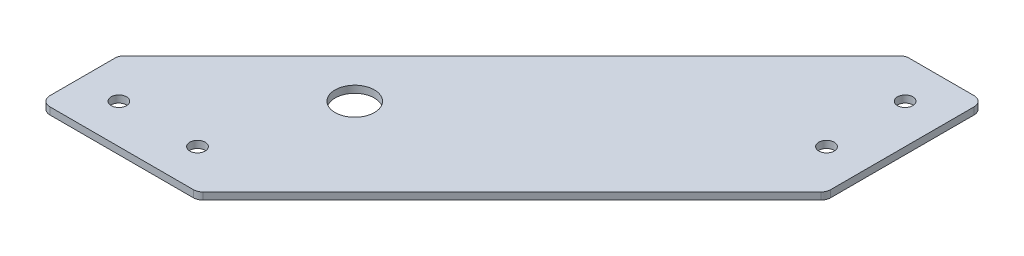
ISO-10303-21;
HEADER;
FILE_DESCRIPTION(('STEP AP214'),'2;1');
FILE_NAME('part.step','',(''),(''),'','','');
FILE_SCHEMA(('AUTOMOTIVE_DESIGN { 1 0 10303 214 1 1 1 1 }'));
ENDSEC;
DATA;
#1=APPLICATION_CONTEXT('core data for automotive mechanical design processes');
#2=APPLICATION_PROTOCOL_DEFINITION('international standard','automotive_design',2000,#1);
#3=PRODUCT_CONTEXT('',#1,'mechanical');
#4=PRODUCT('Part','Part','',(#3));
#5=PRODUCT_RELATED_PRODUCT_CATEGORY('part','',(#4));
#6=PRODUCT_DEFINITION_FORMATION('','',#4);
#7=PRODUCT_DEFINITION_CONTEXT('part definition',#1,'design');
#8=PRODUCT_DEFINITION('design','',#6,#7);
#9=PRODUCT_DEFINITION_SHAPE('','',#8);
#10=(LENGTH_UNIT() NAMED_UNIT(*) SI_UNIT(.MILLI.,.METRE.));
#11=(NAMED_UNIT(*) PLANE_ANGLE_UNIT() SI_UNIT($,.RADIAN.));
#12=(NAMED_UNIT(*) SI_UNIT($,.STERADIAN.) SOLID_ANGLE_UNIT());
#13=UNCERTAINTY_MEASURE_WITH_UNIT(LENGTH_MEASURE(1.E-05),#10,'distance_accuracy_value','');
#14=(GEOMETRIC_REPRESENTATION_CONTEXT(3) GLOBAL_UNCERTAINTY_ASSIGNED_CONTEXT((#13)) GLOBAL_UNIT_ASSIGNED_CONTEXT((#10,
#11,#12)) REPRESENTATION_CONTEXT('',''));
#15=CARTESIAN_POINT('',(0.,0.,0.));
#16=DIRECTION('',(0.,0.,1.));
#17=DIRECTION('',(1.,0.,0.));
#18=AXIS2_PLACEMENT_3D('',#15,#16,#17);
#19=CARTESIAN_POINT('',(0.,1.143,0.));
#20=DIRECTION('',(0.,1.,0.));
#21=DIRECTION('',(0.,0.,1.));
#22=AXIS2_PLACEMENT_3D('',#19,#20,#21);
#23=PLANE('',#22);
#24=DIRECTION('',(0.,0.,1.));
#25=VECTOR('',#24,1.);
#26=CARTESIAN_POINT('',(-152.4,1.143,-25.4));
#27=LINE('',#26,#25);
#28=CARTESIAN_POINT('',(-152.4,1.143,-24.0848719394655));
#29=VERTEX_POINT('',#28);
#30=CARTESIAN_POINT('',(-152.4,1.143,-3.175));
#31=VERTEX_POINT('',#30);
#32=EDGE_CURVE('E164',#29,#31,#27,.T.);
#33=ORIENTED_EDGE('',*,*,#32,.T.);
#34=CARTESIAN_POINT('',(-149.225,1.143,-3.175));
#35=DIRECTION('',(0.,1.,0.));
#36=DIRECTION('',(0.,0.,1.));
#37=AXIS2_PLACEMENT_3D('',#34,#35,#36);
#38=CIRCLE('',#37,3.175);
#39=CARTESIAN_POINT('',(-149.225,1.143,0.));
#40=VERTEX_POINT('',#39);
#41=EDGE_CURVE('E193',#31,#40,#38,.T.);
#42=ORIENTED_EDGE('',*,*,#41,.T.);
#43=DIRECTION('',(1.,0.,0.));
#44=VECTOR('',#43,1.);
#45=CARTESIAN_POINT('',(-152.4,1.143,0.));
#46=LINE('',#45,#44);
#47=CARTESIAN_POINT('',(-102.915128060536,1.143,0.));
#48=VERTEX_POINT('',#47);
#49=EDGE_CURVE('E145',#40,#48,#46,.T.);
#50=ORIENTED_EDGE('',*,*,#49,.T.);
#51=CARTESIAN_POINT('',(-102.915128060536,1.143,-3.175));
#52=DIRECTION('',(0.,1.,0.));
#53=DIRECTION('',(0.,0.,1.));
#54=AXIS2_PLACEMENT_3D('',#51,#52,#53);
#55=CIRCLE('',#54,3.175);
#56=CARTESIAN_POINT('',(-100.670064030268,1.143,-0.929935969732676));
#57=VERTEX_POINT('',#56);
#58=EDGE_CURVE('E186',#48,#57,#55,.T.);
#59=ORIENTED_EDGE('',*,*,#58,.T.);
#60=DIRECTION('',(-0.707106781186551,0.,0.707106781186544));
#61=VECTOR('',#60,1.);
#62=CARTESIAN_POINT('',(0.,1.143,-101.6));
#63=LINE('',#62,#61);
#64=CARTESIAN_POINT('',(-0.929935969732728,1.143,-100.670064030267));
#65=VERTEX_POINT('',#64);
#66=EDGE_CURVE('E215',#65,#57,#63,.T.);
#67=ORIENTED_EDGE('',*,*,#66,.F.);
#68=CARTESIAN_POINT('',(-3.175,1.143,-102.915128060535));
#69=DIRECTION('',(0.,1.,0.));
#70=DIRECTION('',(0.,0.,1.));
#71=AXIS2_PLACEMENT_3D('',#68,#69,#70);
#72=CIRCLE('',#71,3.175);
#73=CARTESIAN_POINT('',(0.,1.143,-102.915128060535));
#74=VERTEX_POINT('',#73);
#75=EDGE_CURVE('E188',#65,#74,#72,.T.);
#76=ORIENTED_EDGE('',*,*,#75,.T.);
#77=DIRECTION('',(0.,0.,-1.));
#78=VECTOR('',#77,1.);
#79=CARTESIAN_POINT('',(0.,1.143,0.));
#80=LINE('',#79,#78);
#81=CARTESIAN_POINT('',(0.,1.143,-149.225));
#82=VERTEX_POINT('',#81);
#83=EDGE_CURVE('E224',#74,#82,#80,.T.);
#84=ORIENTED_EDGE('',*,*,#83,.T.);
#85=CARTESIAN_POINT('',(-3.175,1.143,-149.225));
#86=DIRECTION('',(0.,1.,0.));
#87=DIRECTION('',(0.,0.,1.));
#88=AXIS2_PLACEMENT_3D('',#85,#86,#87);
#89=CIRCLE('',#88,3.175);
#90=CARTESIAN_POINT('',(-3.175,1.143,-152.4));
#91=VERTEX_POINT('',#90);
#92=EDGE_CURVE('E190',#82,#91,#89,.T.);
#93=ORIENTED_EDGE('',*,*,#92,.T.);
#94=DIRECTION('',(-1.,0.,0.));
#95=VECTOR('',#94,1.);
#96=CARTESIAN_POINT('',(0.,1.143,-152.4));
#97=LINE('',#96,#95);
#98=CARTESIAN_POINT('',(-24.0848719394654,1.143,-152.4));
#99=VERTEX_POINT('',#98);
#100=EDGE_CURVE('E227',#91,#99,#97,.T.);
#101=ORIENTED_EDGE('',*,*,#100,.T.);
#102=CARTESIAN_POINT('',(-24.0848719394654,1.143,-149.225));
#103=DIRECTION('',(0.,1.,0.));
#104=DIRECTION('',(0.,0.,1.));
#105=AXIS2_PLACEMENT_3D('',#102,#103,#104);
#106=CIRCLE('',#105,3.175);
#107=CARTESIAN_POINT('',(-26.3299359697327,1.143,-151.470064030267));
#108=VERTEX_POINT('',#107);
#109=EDGE_CURVE('E55',#99,#108,#106,.T.);
#110=ORIENTED_EDGE('',*,*,#109,.T.);
#111=DIRECTION('',(-0.707106781186548,0.,0.707106781186548));
#112=VECTOR('',#111,1.);
#113=CARTESIAN_POINT('',(-25.4,1.143,-152.4));
#114=LINE('',#113,#112);
#115=CARTESIAN_POINT('',(-151.470064030267,1.143,-26.3299359697327));
#116=VERTEX_POINT('',#115);
#117=EDGE_CURVE('E231',#108,#116,#114,.T.);
#118=ORIENTED_EDGE('',*,*,#117,.T.);
#119=CARTESIAN_POINT('',(-149.225,1.143,-24.0848719394655));
#120=DIRECTION('',(0.,1.,0.));
#121=DIRECTION('',(0.,0.,1.));
#122=AXIS2_PLACEMENT_3D('',#119,#120,#121);
#123=CIRCLE('',#122,3.175);
#124=EDGE_CURVE('E184',#116,#29,#123,.T.);
#125=ORIENTED_EDGE('',*,*,#124,.T.);
#126=EDGE_LOOP('',(#33,#42,#50,#59,#67,#76,#84,#93,#101,#110,#118,#125));
#127=FACE_BOUND('',#126,.T.);
#128=CARTESIAN_POINT('',(-139.7,1.143,-12.6999999999939));
#129=DIRECTION('',(0.,1.,0.));
#130=DIRECTION('',(0.,0.,1.));
#131=AXIS2_PLACEMENT_3D('',#128,#129,#130);
#132=CIRCLE('',#131,2.4892);
#133=CARTESIAN_POINT('',(-139.7,1.143,-10.2107999999939));
#134=VERTEX_POINT('',#133);
#135=EDGE_CURVE('E267',#134,#134,#132,.T.);
#136=ORIENTED_EDGE('',*,*,#135,.F.);
#137=EDGE_LOOP('',(#136));
#138=FACE_BOUND('',#137,.T.);
#139=CARTESIAN_POINT('',(-114.3,1.143,-12.6999999999951));
#140=DIRECTION('',(0.,1.,0.));
#141=DIRECTION('',(0.,0.,1.));
#142=AXIS2_PLACEMENT_3D('',#139,#140,#141);
#143=CIRCLE('',#142,2.4892);
#144=CARTESIAN_POINT('',(-114.3,1.143,-10.2107999999951));
#145=VERTEX_POINT('',#144);
#146=EDGE_CURVE('E155',#145,#145,#143,.T.);
#147=ORIENTED_EDGE('',*,*,#146,.F.);
#148=EDGE_LOOP('',(#147));
#149=FACE_BOUND('',#148,.T.);
#150=CARTESIAN_POINT('',(-101.6,1.143,-50.8));
#151=DIRECTION('',(0.,1.,0.));
#152=DIRECTION('',(0.,0.,1.));
#153=AXIS2_PLACEMENT_3D('',#150,#151,#152);
#154=CIRCLE('',#153,6.35000000000001);
#155=CARTESIAN_POINT('',(-101.6,1.143,-44.45));
#156=VERTEX_POINT('',#155);
#157=EDGE_CURVE('E279',#156,#156,#154,.T.);
#158=ORIENTED_EDGE('',*,*,#157,.F.);
#159=EDGE_LOOP('',(#158));
#160=FACE_BOUND('',#159,.T.);
#161=CARTESIAN_POINT('',(-12.7000000000003,1.143,-114.3));
#162=DIRECTION('',(0.,1.,0.));
#163=DIRECTION('',(0.,0.,1.));
#164=AXIS2_PLACEMENT_3D('',#161,#162,#163);
#165=CIRCLE('',#164,2.48919999999999);
#166=CARTESIAN_POINT('',(-12.7000000000003,1.143,-111.8108));
#167=VERTEX_POINT('',#166);
#168=EDGE_CURVE('E273',#167,#167,#165,.T.);
#169=ORIENTED_EDGE('',*,*,#168,.F.);
#170=EDGE_LOOP('',(#169));
#171=FACE_BOUND('',#170,.T.);
#172=CARTESIAN_POINT('',(-12.7000000000004,1.143,-139.7));
#173=DIRECTION('',(0.,1.,0.));
#174=DIRECTION('',(0.,0.,1.));
#175=AXIS2_PLACEMENT_3D('',#172,#173,#174);
#176=CIRCLE('',#175,2.4892);
#177=CARTESIAN_POINT('',(-12.7000000000004,1.143,-137.2108));
#178=VERTEX_POINT('',#177);
#179=EDGE_CURVE('E261',#178,#178,#176,.T.);
#180=ORIENTED_EDGE('',*,*,#179,.F.);
#181=EDGE_LOOP('',(#180));
#182=FACE_BOUND('',#181,.T.);
#183=ADVANCED_FACE('F33',(#127,#138,#149,#160,#171,#182),#23,.T.);
#184=CARTESIAN_POINT('',(0.,-1.143,0.));
#185=DIRECTION('',(0.,1.,0.));
#186=DIRECTION('',(0.,0.,1.));
#187=AXIS2_PLACEMENT_3D('',#184,#185,#186);
#188=PLANE('',#187);
#189=DIRECTION('',(1.,0.,0.));
#190=VECTOR('',#189,1.);
#191=CARTESIAN_POINT('',(-152.4,-1.143,0.));
#192=LINE('',#191,#190);
#193=CARTESIAN_POINT('',(-149.225,-1.143,0.));
#194=VERTEX_POINT('',#193);
#195=CARTESIAN_POINT('',(-102.915128060536,-1.143,0.));
#196=VERTEX_POINT('',#195);
#197=EDGE_CURVE('E142',#194,#196,#192,.T.);
#198=ORIENTED_EDGE('',*,*,#197,.F.);
#199=CARTESIAN_POINT('',(-149.225,-1.143,-3.175));
#200=DIRECTION('',(0.,1.,0.));
#201=DIRECTION('',(0.,0.,1.));
#202=AXIS2_PLACEMENT_3D('',#199,#200,#201);
#203=CIRCLE('',#202,3.175);
#204=CARTESIAN_POINT('',(-152.4,-1.143,-3.175));
#205=VERTEX_POINT('',#204);
#206=EDGE_CURVE('E124',#194,#205,#203,.F.);
#207=ORIENTED_EDGE('',*,*,#206,.T.);
#208=DIRECTION('',(0.,0.,1.));
#209=VECTOR('',#208,1.);
#210=CARTESIAN_POINT('',(-152.4,-1.143,-25.4));
#211=LINE('',#210,#209);
#212=CARTESIAN_POINT('',(-152.4,-1.143,-24.0848719394655));
#213=VERTEX_POINT('',#212);
#214=EDGE_CURVE('E171',#213,#205,#211,.T.);
#215=ORIENTED_EDGE('',*,*,#214,.F.);
#216=CARTESIAN_POINT('',(-149.225,-1.143,-24.0848719394655));
#217=DIRECTION('',(0.,1.,0.));
#218=DIRECTION('',(0.,0.,1.));
#219=AXIS2_PLACEMENT_3D('',#216,#217,#218);
#220=CIRCLE('',#219,3.175);
#221=CARTESIAN_POINT('',(-151.470064030267,-1.143,-26.3299359697327));
#222=VERTEX_POINT('',#221);
#223=EDGE_CURVE('E146',#213,#222,#220,.F.);
#224=ORIENTED_EDGE('',*,*,#223,.T.);
#225=DIRECTION('',(-0.707106781186548,0.,0.707106781186548));
#226=VECTOR('',#225,1.);
#227=CARTESIAN_POINT('',(-25.4,-1.143,-152.4));
#228=LINE('',#227,#226);
#229=CARTESIAN_POINT('',(-26.3299359697327,-1.143,-151.470064030267));
#230=VERTEX_POINT('',#229);
#231=EDGE_CURVE('E169',#230,#222,#228,.T.);
#232=ORIENTED_EDGE('',*,*,#231,.F.);
#233=CARTESIAN_POINT('',(-24.0848719394654,-1.143,-149.225));
#234=DIRECTION('',(0.,1.,0.));
#235=DIRECTION('',(0.,0.,1.));
#236=AXIS2_PLACEMENT_3D('',#233,#234,#235);
#237=CIRCLE('',#236,3.175);
#238=CARTESIAN_POINT('',(-24.0848719394654,-1.143,-152.4));
#239=VERTEX_POINT('',#238);
#240=EDGE_CURVE('E135',#230,#239,#237,.F.);
#241=ORIENTED_EDGE('',*,*,#240,.T.);
#242=DIRECTION('',(-1.,0.,0.));
#243=VECTOR('',#242,1.);
#244=CARTESIAN_POINT('',(0.,-1.143,-152.4));
#245=LINE('',#244,#243);
#246=CARTESIAN_POINT('',(-3.175,-1.143,-152.4));
#247=VERTEX_POINT('',#246);
#248=EDGE_CURVE('E158',#247,#239,#245,.T.);
#249=ORIENTED_EDGE('',*,*,#248,.F.);
#250=CARTESIAN_POINT('',(-3.175,-1.143,-149.225));
#251=DIRECTION('',(0.,1.,0.));
#252=DIRECTION('',(0.,0.,1.));
#253=AXIS2_PLACEMENT_3D('',#250,#251,#252);
#254=CIRCLE('',#253,3.175);
#255=CARTESIAN_POINT('',(0.,-1.143,-149.225));
#256=VERTEX_POINT('',#255);
#257=EDGE_CURVE('E178',#247,#256,#254,.F.);
#258=ORIENTED_EDGE('',*,*,#257,.T.);
#259=DIRECTION('',(0.,0.,-1.));
#260=VECTOR('',#259,1.);
#261=CARTESIAN_POINT('',(0.,-1.143,0.));
#262=LINE('',#261,#260);
#263=CARTESIAN_POINT('',(0.,-1.143,-102.915128060535));
#264=VERTEX_POINT('',#263);
#265=EDGE_CURVE('E154',#264,#256,#262,.T.);
#266=ORIENTED_EDGE('',*,*,#265,.F.);
#267=CARTESIAN_POINT('',(-3.175,-1.143,-102.915128060535));
#268=DIRECTION('',(0.,1.,0.));
#269=DIRECTION('',(0.,0.,1.));
#270=AXIS2_PLACEMENT_3D('',#267,#268,#269);
#271=CIRCLE('',#270,3.175);
#272=CARTESIAN_POINT('',(-0.929935969732728,-1.143,-100.670064030267));
#273=VERTEX_POINT('',#272);
#274=EDGE_CURVE('E176',#264,#273,#271,.F.);
#275=ORIENTED_EDGE('',*,*,#274,.T.);
#276=DIRECTION('',(-0.707106781186551,0.,0.707106781186544));
#277=VECTOR('',#276,1.);
#278=CARTESIAN_POINT('',(0.,-1.143,-101.6));
#279=LINE('',#278,#277);
#280=CARTESIAN_POINT('',(-100.670064030268,-1.143,-0.929935969732676));
#281=VERTEX_POINT('',#280);
#282=EDGE_CURVE('E212',#273,#281,#279,.T.);
#283=ORIENTED_EDGE('',*,*,#282,.T.);
#284=CARTESIAN_POINT('',(-102.915128060536,-1.143,-3.175));
#285=DIRECTION('',(0.,1.,0.));
#286=DIRECTION('',(0.,0.,1.));
#287=AXIS2_PLACEMENT_3D('',#284,#285,#286);
#288=CIRCLE('',#287,3.175);
#289=EDGE_CURVE('E153',#281,#196,#288,.F.);
#290=ORIENTED_EDGE('',*,*,#289,.T.);
#291=EDGE_LOOP('',(#198,#207,#215,#224,#232,#241,#249,#258,#266,#275,#283,#290));
#292=FACE_BOUND('',#291,.T.);
#293=CARTESIAN_POINT('',(-139.7,-1.143,-12.6999999999939));
#294=DIRECTION('',(0.,1.,0.));
#295=DIRECTION('',(0.,0.,1.));
#296=AXIS2_PLACEMENT_3D('',#293,#294,#295);
#297=CIRCLE('',#296,2.4892);
#298=CARTESIAN_POINT('',(-139.7,-1.143,-10.2107999999939));
#299=VERTEX_POINT('',#298);
#300=EDGE_CURVE('E264',#299,#299,#297,.T.);
#301=ORIENTED_EDGE('',*,*,#300,.T.);
#302=EDGE_LOOP('',(#301));
#303=FACE_BOUND('',#302,.T.);
#304=CARTESIAN_POINT('',(-114.3,-1.143,-12.6999999999951));
#305=DIRECTION('',(0.,1.,0.));
#306=DIRECTION('',(0.,0.,1.));
#307=AXIS2_PLACEMENT_3D('',#304,#305,#306);
#308=CIRCLE('',#307,2.4892);
#309=CARTESIAN_POINT('',(-114.3,-1.143,-10.2107999999951));
#310=VERTEX_POINT('',#309);
#311=EDGE_CURVE('E161',#310,#310,#308,.T.);
#312=ORIENTED_EDGE('',*,*,#311,.T.);
#313=EDGE_LOOP('',(#312));
#314=FACE_BOUND('',#313,.T.);
#315=CARTESIAN_POINT('',(-101.6,-1.143,-50.8));
#316=DIRECTION('',(0.,1.,0.));
#317=DIRECTION('',(0.,0.,1.));
#318=AXIS2_PLACEMENT_3D('',#315,#316,#317);
#319=CIRCLE('',#318,6.35000000000001);
#320=CARTESIAN_POINT('',(-101.6,-1.143,-44.45));
#321=VERTEX_POINT('',#320);
#322=EDGE_CURVE('E276',#321,#321,#319,.T.);
#323=ORIENTED_EDGE('',*,*,#322,.T.);
#324=EDGE_LOOP('',(#323));
#325=FACE_BOUND('',#324,.T.);
#326=CARTESIAN_POINT('',(-12.7000000000003,-1.143,-114.3));
#327=DIRECTION('',(0.,1.,0.));
#328=DIRECTION('',(0.,0.,1.));
#329=AXIS2_PLACEMENT_3D('',#326,#327,#328);
#330=CIRCLE('',#329,2.48919999999999);
#331=CARTESIAN_POINT('',(-12.7000000000003,-1.143,-111.8108));
#332=VERTEX_POINT('',#331);
#333=EDGE_CURVE('E270',#332,#332,#330,.T.);
#334=ORIENTED_EDGE('',*,*,#333,.T.);
#335=EDGE_LOOP('',(#334));
#336=FACE_BOUND('',#335,.T.);
#337=CARTESIAN_POINT('',(-12.7000000000004,-1.143,-139.7));
#338=DIRECTION('',(0.,1.,0.));
#339=DIRECTION('',(0.,0.,1.));
#340=AXIS2_PLACEMENT_3D('',#337,#338,#339);
#341=CIRCLE('',#340,2.4892);
#342=CARTESIAN_POINT('',(-12.7000000000004,-1.143,-137.2108));
#343=VERTEX_POINT('',#342);
#344=EDGE_CURVE('E219',#343,#343,#341,.T.);
#345=ORIENTED_EDGE('',*,*,#344,.T.);
#346=EDGE_LOOP('',(#345));
#347=FACE_BOUND('',#346,.T.);
#348=ADVANCED_FACE('F149',(#292,#303,#314,#325,#336,#347),#188,.F.);
#349=CARTESIAN_POINT('',(-152.4,1.143,0.));
#350=DIRECTION('',(0.,0.,-1.));
#351=DIRECTION('',(-1.,0.,0.));
#352=AXIS2_PLACEMENT_3D('',#349,#350,#351);
#353=PLANE('',#352);
#354=ORIENTED_EDGE('',*,*,#49,.F.);
#355=DIRECTION('',(0.,-1.,0.));
#356=VECTOR('',#355,1.);
#357=CARTESIAN_POINT('',(-149.225,1.143,0.));
#358=LINE('',#357,#356);
#359=EDGE_CURVE('E128',#40,#194,#358,.T.);
#360=ORIENTED_EDGE('',*,*,#359,.T.);
#361=ORIENTED_EDGE('',*,*,#197,.T.);
#362=DIRECTION('',(0.,1.,0.));
#363=VECTOR('',#362,1.);
#364=CARTESIAN_POINT('',(-102.915128060536,1.143,0.));
#365=LINE('',#364,#363);
#366=EDGE_CURVE('E147',#196,#48,#365,.T.);
#367=ORIENTED_EDGE('',*,*,#366,.T.);
#368=EDGE_LOOP('',(#354,#360,#361,#367));
#369=FACE_BOUND('',#368,.T.);
#370=ADVANCED_FACE('F140',(#369),#353,.F.);
#371=CARTESIAN_POINT('',(0.,1.143,0.));
#372=DIRECTION('',(-1.,0.,0.));
#373=DIRECTION('',(0.,0.,1.));
#374=AXIS2_PLACEMENT_3D('',#371,#372,#373);
#375=PLANE('',#374);
#376=ORIENTED_EDGE('',*,*,#265,.T.);
#377=DIRECTION('',(0.,-1.,0.));
#378=VECTOR('',#377,1.);
#379=CARTESIAN_POINT('',(0.,1.143,-149.225));
#380=LINE('',#379,#378);
#381=EDGE_CURVE('E206',#256,#82,#380,.F.);
#382=ORIENTED_EDGE('',*,*,#381,.T.);
#383=ORIENTED_EDGE('',*,*,#83,.F.);
#384=DIRECTION('',(0.,1.,0.));
#385=VECTOR('',#384,1.);
#386=CARTESIAN_POINT('',(0.,1.143,-102.915128060535));
#387=LINE('',#386,#385);
#388=EDGE_CURVE('E204',#74,#264,#387,.F.);
#389=ORIENTED_EDGE('',*,*,#388,.T.);
#390=EDGE_LOOP('',(#376,#382,#383,#389));
#391=FACE_BOUND('',#390,.T.);
#392=ADVANCED_FACE('F254',(#391),#375,.F.);
#393=CARTESIAN_POINT('',(0.,1.143,-152.4));
#394=DIRECTION('',(0.,0.,1.));
#395=DIRECTION('',(1.,0.,0.));
#396=AXIS2_PLACEMENT_3D('',#393,#394,#395);
#397=PLANE('',#396);
#398=ORIENTED_EDGE('',*,*,#248,.T.);
#399=DIRECTION('',(0.,-1.,0.));
#400=VECTOR('',#399,1.);
#401=CARTESIAN_POINT('',(-24.0848719394654,1.143,-152.4));
#402=LINE('',#401,#400);
#403=EDGE_CURVE('E202',#239,#99,#402,.F.);
#404=ORIENTED_EDGE('',*,*,#403,.T.);
#405=ORIENTED_EDGE('',*,*,#100,.F.);
#406=DIRECTION('',(0.,-1.,0.));
#407=VECTOR('',#406,1.);
#408=CARTESIAN_POINT('',(-3.175,1.143,-152.4));
#409=LINE('',#408,#407);
#410=EDGE_CURVE('E199',#91,#247,#409,.T.);
#411=ORIENTED_EDGE('',*,*,#410,.T.);
#412=EDGE_LOOP('',(#398,#404,#405,#411));
#413=FACE_BOUND('',#412,.T.);
#414=ADVANCED_FACE('F246',(#413),#397,.F.);
#415=CARTESIAN_POINT('',(-25.4,1.143,-152.4));
#416=DIRECTION('',(0.707106781186548,0.,0.707106781186548));
#417=DIRECTION('',(0.707106781186548,0.,-0.707106781186548));
#418=AXIS2_PLACEMENT_3D('',#415,#416,#417);
#419=PLANE('',#418);
#420=ORIENTED_EDGE('',*,*,#117,.F.);
#421=DIRECTION('',(0.,-1.,0.));
#422=VECTOR('',#421,1.);
#423=CARTESIAN_POINT('',(-26.3299359697327,1.143,-151.470064030267));
#424=LINE('',#423,#422);
#425=EDGE_CURVE('E196',#108,#230,#424,.T.);
#426=ORIENTED_EDGE('',*,*,#425,.T.);
#427=ORIENTED_EDGE('',*,*,#231,.T.);
#428=DIRECTION('',(0.,-1.,0.));
#429=VECTOR('',#428,1.);
#430=CARTESIAN_POINT('',(-151.470064030267,1.143,-26.3299359697327));
#431=LINE('',#430,#429);
#432=EDGE_CURVE('E48',#222,#116,#431,.F.);
#433=ORIENTED_EDGE('',*,*,#432,.T.);
#434=EDGE_LOOP('',(#420,#426,#427,#433));
#435=FACE_BOUND('',#434,.T.);
#436=ADVANCED_FACE('F239',(#435),#419,.F.);
#437=CARTESIAN_POINT('',(-152.4,1.143,-25.4));
#438=DIRECTION('',(1.,0.,0.));
#439=DIRECTION('',(0.,0.,-1.));
#440=AXIS2_PLACEMENT_3D('',#437,#438,#439);
#441=PLANE('',#440);
#442=ORIENTED_EDGE('',*,*,#214,.T.);
#443=DIRECTION('',(0.,-1.,0.));
#444=VECTOR('',#443,1.);
#445=CARTESIAN_POINT('',(-152.4,1.143,-3.175));
#446=LINE('',#445,#444);
#447=EDGE_CURVE('E129',#205,#31,#446,.F.);
#448=ORIENTED_EDGE('',*,*,#447,.T.);
#449=ORIENTED_EDGE('',*,*,#32,.F.);
#450=DIRECTION('',(0.,-1.,0.));
#451=VECTOR('',#450,1.);
#452=CARTESIAN_POINT('',(-152.4,1.143,-24.0848719394655));
#453=LINE('',#452,#451);
#454=EDGE_CURVE('E134',#29,#213,#453,.T.);
#455=ORIENTED_EDGE('',*,*,#454,.T.);
#456=EDGE_LOOP('',(#442,#448,#449,#455));
#457=FACE_BOUND('',#456,.T.);
#458=ADVANCED_FACE('F236',(#457),#441,.F.);
#459=CARTESIAN_POINT('',(-114.3,1.143,-12.6999999999951));
#460=DIRECTION('',(0.,-1.,0.));
#461=DIRECTION('',(0.,0.,-1.));
#462=AXIS2_PLACEMENT_3D('',#459,#460,#461);
#463=CYLINDRICAL_SURFACE('',#462,2.4892);
#464=ORIENTED_EDGE('',*,*,#146,.T.);
#465=EDGE_LOOP('',(#464));
#466=FACE_BOUND('',#465,.T.);
#467=ORIENTED_EDGE('',*,*,#311,.F.);
#468=EDGE_LOOP('',(#467));
#469=FACE_BOUND('',#468,.T.);
#470=ADVANCED_FACE('F290',(#466,#469),#463,.F.);
#471=CARTESIAN_POINT('',(-101.6,1.143,-50.8));
#472=DIRECTION('',(0.,-1.,0.));
#473=DIRECTION('',(0.,0.,-1.));
#474=AXIS2_PLACEMENT_3D('',#471,#472,#473);
#475=CYLINDRICAL_SURFACE('',#474,6.35000000000001);
#476=ORIENTED_EDGE('',*,*,#157,.T.);
#477=EDGE_LOOP('',(#476));
#478=FACE_BOUND('',#477,.T.);
#479=ORIENTED_EDGE('',*,*,#322,.F.);
#480=EDGE_LOOP('',(#479));
#481=FACE_BOUND('',#480,.T.);
#482=ADVANCED_FACE('F287',(#478,#481),#475,.F.);
#483=CARTESIAN_POINT('',(-12.7000000000003,1.143,-114.3));
#484=DIRECTION('',(0.,-1.,0.));
#485=DIRECTION('',(0.,0.,-1.));
#486=AXIS2_PLACEMENT_3D('',#483,#484,#485);
#487=CYLINDRICAL_SURFACE('',#486,2.48919999999999);
#488=ORIENTED_EDGE('',*,*,#168,.T.);
#489=EDGE_LOOP('',(#488));
#490=FACE_BOUND('',#489,.T.);
#491=ORIENTED_EDGE('',*,*,#333,.F.);
#492=EDGE_LOOP('',(#491));
#493=FACE_BOUND('',#492,.T.);
#494=ADVANCED_FACE('F289',(#490,#493),#487,.F.);
#495=CARTESIAN_POINT('',(-139.7,1.143,-12.6999999999939));
#496=DIRECTION('',(0.,-1.,0.));
#497=DIRECTION('',(0.,0.,-1.));
#498=AXIS2_PLACEMENT_3D('',#495,#496,#497);
#499=CYLINDRICAL_SURFACE('',#498,2.4892);
#500=ORIENTED_EDGE('',*,*,#135,.T.);
#501=EDGE_LOOP('',(#500));
#502=FACE_BOUND('',#501,.T.);
#503=ORIENTED_EDGE('',*,*,#300,.F.);
#504=EDGE_LOOP('',(#503));
#505=FACE_BOUND('',#504,.T.);
#506=ADVANCED_FACE('F297',(#502,#505),#499,.F.);
#507=CARTESIAN_POINT('',(-12.7000000000004,1.143,-139.7));
#508=DIRECTION('',(0.,-1.,0.));
#509=DIRECTION('',(0.,0.,-1.));
#510=AXIS2_PLACEMENT_3D('',#507,#508,#509);
#511=CYLINDRICAL_SURFACE('',#510,2.4892);
#512=ORIENTED_EDGE('',*,*,#179,.T.);
#513=EDGE_LOOP('',(#512));
#514=FACE_BOUND('',#513,.T.);
#515=ORIENTED_EDGE('',*,*,#344,.F.);
#516=EDGE_LOOP('',(#515));
#517=FACE_BOUND('',#516,.T.);
#518=ADVANCED_FACE('F369',(#514,#517),#511,.F.);
#519=CARTESIAN_POINT('',(0.,-1.143,-101.6));
#520=DIRECTION('',(-0.707106781186544,0.,-0.707106781186551));
#521=DIRECTION('',(-0.707106781186551,0.,0.707106781186544));
#522=AXIS2_PLACEMENT_3D('',#519,#520,#521);
#523=PLANE('',#522);
#524=ORIENTED_EDGE('',*,*,#282,.F.);
#525=DIRECTION('',(0.,1.,0.));
#526=VECTOR('',#525,1.);
#527=CARTESIAN_POINT('',(-0.929935969732728,-1.143,-100.670064030267));
#528=LINE('',#527,#526);
#529=EDGE_CURVE('E11',#273,#65,#528,.T.);
#530=ORIENTED_EDGE('',*,*,#529,.T.);
#531=ORIENTED_EDGE('',*,*,#66,.T.);
#532=DIRECTION('',(0.,1.,0.));
#533=VECTOR('',#532,1.);
#534=CARTESIAN_POINT('',(-100.670064030268,-1.143,-0.929935969732704));
#535=LINE('',#534,#533);
#536=EDGE_CURVE('E41',#57,#281,#535,.F.);
#537=ORIENTED_EDGE('',*,*,#536,.T.);
#538=EDGE_LOOP('',(#524,#530,#531,#537));
#539=FACE_BOUND('',#538,.T.);
#540=ADVANCED_FACE('F211',(#539),#523,.F.);
#541=CARTESIAN_POINT('',(-149.225,1.143,-3.175));
#542=DIRECTION('',(0.,-1.,0.));
#543=DIRECTION('',(0.,0.,-1.));
#544=AXIS2_PLACEMENT_3D('',#541,#542,#543);
#545=CYLINDRICAL_SURFACE('',#544,3.175);
#546=ORIENTED_EDGE('',*,*,#41,.F.);
#547=ORIENTED_EDGE('',*,*,#447,.F.);
#548=ORIENTED_EDGE('',*,*,#206,.F.);
#549=ORIENTED_EDGE('',*,*,#359,.F.);
#550=EDGE_LOOP('',(#546,#547,#548,#549));
#551=FACE_BOUND('',#550,.T.);
#552=ADVANCED_FACE('F127',(#551),#545,.T.);
#553=CARTESIAN_POINT('',(-24.0848719394654,1.143,-149.225));
#554=DIRECTION('',(0.,-1.,0.));
#555=DIRECTION('',(0.,0.,-1.));
#556=AXIS2_PLACEMENT_3D('',#553,#554,#555);
#557=CYLINDRICAL_SURFACE('',#556,3.175);
#558=ORIENTED_EDGE('',*,*,#109,.F.);
#559=ORIENTED_EDGE('',*,*,#403,.F.);
#560=ORIENTED_EDGE('',*,*,#240,.F.);
#561=ORIENTED_EDGE('',*,*,#425,.F.);
#562=EDGE_LOOP('',(#558,#559,#560,#561));
#563=FACE_BOUND('',#562,.T.);
#564=ADVANCED_FACE('F242',(#563),#557,.T.);
#565=CARTESIAN_POINT('',(-3.175,1.143,-149.225));
#566=DIRECTION('',(0.,-1.,0.));
#567=DIRECTION('',(0.,0.,-1.));
#568=AXIS2_PLACEMENT_3D('',#565,#566,#567);
#569=CYLINDRICAL_SURFACE('',#568,3.175);
#570=ORIENTED_EDGE('',*,*,#92,.F.);
#571=ORIENTED_EDGE('',*,*,#381,.F.);
#572=ORIENTED_EDGE('',*,*,#257,.F.);
#573=ORIENTED_EDGE('',*,*,#410,.F.);
#574=EDGE_LOOP('',(#570,#571,#572,#573));
#575=FACE_BOUND('',#574,.T.);
#576=ADVANCED_FACE('F251',(#575),#569,.T.);
#577=CARTESIAN_POINT('',(-3.175,-1.143,-102.915128060535));
#578=DIRECTION('',(0.,1.,0.));
#579=DIRECTION('',(0.,0.,1.));
#580=AXIS2_PLACEMENT_3D('',#577,#578,#579);
#581=CYLINDRICAL_SURFACE('',#580,3.175);
#582=ORIENTED_EDGE('',*,*,#274,.F.);
#583=ORIENTED_EDGE('',*,*,#388,.F.);
#584=ORIENTED_EDGE('',*,*,#75,.F.);
#585=ORIENTED_EDGE('',*,*,#529,.F.);
#586=EDGE_LOOP('',(#582,#583,#584,#585));
#587=FACE_BOUND('',#586,.T.);
#588=ADVANCED_FACE('F258',(#587),#581,.T.);
#589=CARTESIAN_POINT('',(-102.915128060536,1.143,-3.175));
#590=DIRECTION('',(0.,1.,0.));
#591=DIRECTION('',(0.,0.,1.));
#592=AXIS2_PLACEMENT_3D('',#589,#590,#591);
#593=CYLINDRICAL_SURFACE('',#592,3.175);
#594=ORIENTED_EDGE('',*,*,#289,.F.);
#595=ORIENTED_EDGE('',*,*,#536,.F.);
#596=ORIENTED_EDGE('',*,*,#58,.F.);
#597=ORIENTED_EDGE('',*,*,#366,.F.);
#598=EDGE_LOOP('',(#594,#595,#596,#597));
#599=FACE_BOUND('',#598,.T.);
#600=ADVANCED_FACE('F221',(#599),#593,.T.);
#601=CARTESIAN_POINT('',(-149.225,1.143,-24.0848719394655));
#602=DIRECTION('',(0.,-1.,0.));
#603=DIRECTION('',(0.,0.,-1.));
#604=AXIS2_PLACEMENT_3D('',#601,#602,#603);
#605=CYLINDRICAL_SURFACE('',#604,3.175);
#606=ORIENTED_EDGE('',*,*,#124,.F.);
#607=ORIENTED_EDGE('',*,*,#432,.F.);
#608=ORIENTED_EDGE('',*,*,#223,.F.);
#609=ORIENTED_EDGE('',*,*,#454,.F.);
#610=EDGE_LOOP('',(#606,#607,#608,#609));
#611=FACE_BOUND('',#610,.T.);
#612=ADVANCED_FACE('F35',(#611),#605,.T.);
#613=CLOSED_SHELL('',(#183,#348,#370,#392,#414,#436,#458,#470,#482,#494,#506,#518,#540,#552,
#564,#576,#588,#600,#612));
#614=MANIFOLD_SOLID_BREP('B2',#613);
#615=ADVANCED_BREP_SHAPE_REPRESENTATION('',(#18,#614),#14);
#616=SHAPE_DEFINITION_REPRESENTATION(#9,#615);
ENDSEC;
END-ISO-10303-21;
